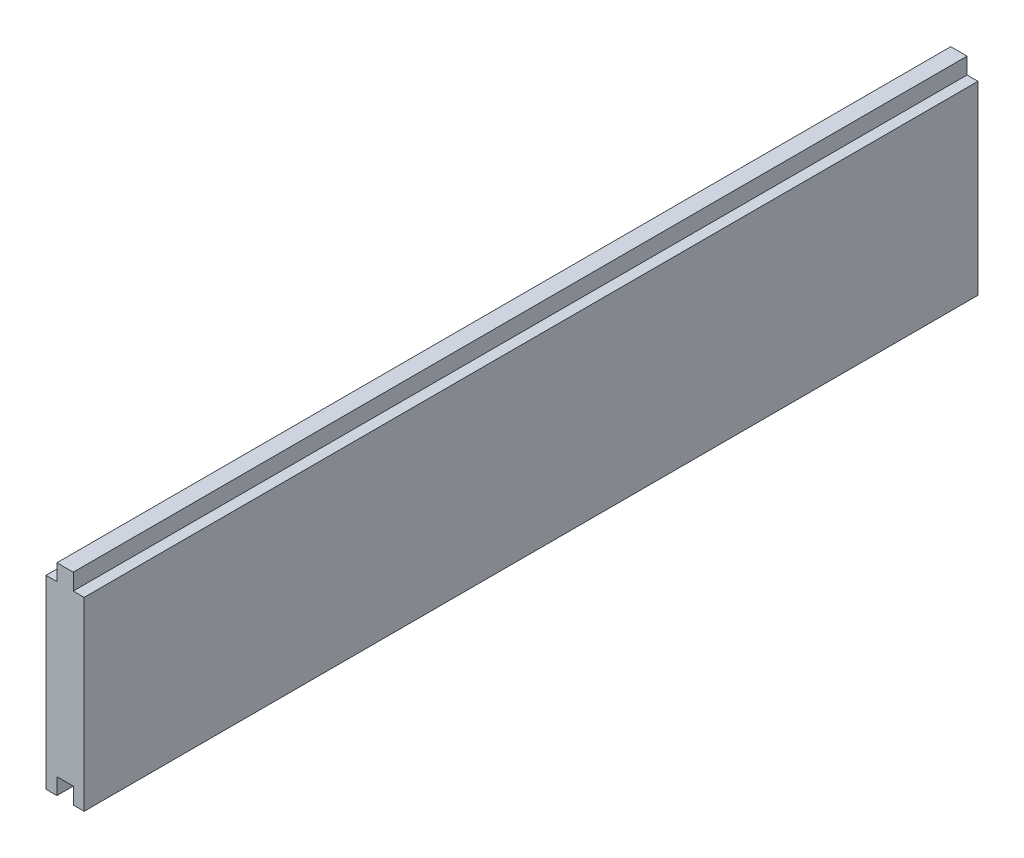
ISO-10303-21;
HEADER;
FILE_DESCRIPTION(('STEP AP214'),'2;1');
FILE_NAME('part.step','',(''),(''),'','','');
FILE_SCHEMA(('AUTOMOTIVE_DESIGN { 1 0 10303 214 1 1 1 1 }'));
ENDSEC;
DATA;
#1=APPLICATION_CONTEXT('core data for automotive mechanical design processes');
#2=APPLICATION_PROTOCOL_DEFINITION('international standard','automotive_design',2000,#1);
#3=PRODUCT_CONTEXT('',#1,'mechanical');
#4=PRODUCT('Part','Part','',(#3));
#5=PRODUCT_RELATED_PRODUCT_CATEGORY('part','',(#4));
#6=PRODUCT_DEFINITION_FORMATION('','',#4);
#7=PRODUCT_DEFINITION_CONTEXT('part definition',#1,'design');
#8=PRODUCT_DEFINITION('design','',#6,#7);
#9=PRODUCT_DEFINITION_SHAPE('','',#8);
#10=(LENGTH_UNIT() NAMED_UNIT(*) SI_UNIT(.MILLI.,.METRE.));
#11=(NAMED_UNIT(*) PLANE_ANGLE_UNIT() SI_UNIT($,.RADIAN.));
#12=(NAMED_UNIT(*) SI_UNIT($,.STERADIAN.) SOLID_ANGLE_UNIT());
#13=UNCERTAINTY_MEASURE_WITH_UNIT(LENGTH_MEASURE(1.E-05),#10,'distance_accuracy_value','');
#14=(GEOMETRIC_REPRESENTATION_CONTEXT(3) GLOBAL_UNCERTAINTY_ASSIGNED_CONTEXT((#13)) GLOBAL_UNIT_ASSIGNED_CONTEXT((#10,
#11,#12)) REPRESENTATION_CONTEXT('',''));
#15=CARTESIAN_POINT('',(0.,0.,0.));
#16=DIRECTION('',(0.,0.,1.));
#17=DIRECTION('',(1.,0.,0.));
#18=AXIS2_PLACEMENT_3D('',#15,#16,#17);
#19=CARTESIAN_POINT('',(10.,0.,-820.));
#20=DIRECTION('',(0.,-1.,0.));
#21=DIRECTION('',(1.,0.,0.));
#22=AXIS2_PLACEMENT_3D('',#19,#20,#21);
#23=PLANE('',#22);
#24=DIRECTION('',(1.,0.,0.));
#25=VECTOR('',#24,1.);
#26=CARTESIAN_POINT('',(10.,0.,0.));
#27=LINE('',#26,#25);
#28=CARTESIAN_POINT('',(0.,0.,0.));
#29=VERTEX_POINT('',#28);
#30=CARTESIAN_POINT('',(10.,0.,0.));
#31=VERTEX_POINT('',#30);
#32=EDGE_CURVE('E157',#29,#31,#27,.T.);
#33=ORIENTED_EDGE('',*,*,#32,.F.);
#34=DIRECTION('',(0.,0.,1.));
#35=VECTOR('',#34,1.);
#36=CARTESIAN_POINT('',(0.,0.,-820.));
#37=LINE('',#36,#35);
#38=CARTESIAN_POINT('',(0.,0.,-820.));
#39=VERTEX_POINT('',#38);
#40=EDGE_CURVE('E11',#39,#29,#37,.T.);
#41=ORIENTED_EDGE('',*,*,#40,.F.);
#42=DIRECTION('',(1.,0.,0.));
#43=VECTOR('',#42,1.);
#44=CARTESIAN_POINT('',(10.,0.,-820.));
#45=LINE('',#44,#43);
#46=CARTESIAN_POINT('',(10.,0.,-820.));
#47=VERTEX_POINT('',#46);
#48=EDGE_CURVE('E189',#39,#47,#45,.T.);
#49=ORIENTED_EDGE('',*,*,#48,.T.);
#50=DIRECTION('',(0.,0.,1.));
#51=VECTOR('',#50,1.);
#52=CARTESIAN_POINT('',(10.,0.,-820.));
#53=LINE('',#52,#51);
#54=EDGE_CURVE('E39',#47,#31,#53,.T.);
#55=ORIENTED_EDGE('',*,*,#54,.T.);
#56=EDGE_LOOP('',(#33,#41,#49,#55));
#57=FACE_BOUND('',#56,.T.);
#58=ADVANCED_FACE('F36',(#57),#23,.T.);
#59=CARTESIAN_POINT('',(0.,0.,-820.));
#60=DIRECTION('',(-1.,0.,0.));
#61=DIRECTION('',(0.,0.,1.));
#62=AXIS2_PLACEMENT_3D('',#59,#60,#61);
#63=PLANE('',#62);
#64=DIRECTION('',(0.,-1.,0.));
#65=VECTOR('',#64,1.);
#66=CARTESIAN_POINT('',(0.,0.,0.));
#67=LINE('',#66,#65);
#68=CARTESIAN_POINT('',(0.,170.,0.));
#69=VERTEX_POINT('',#68);
#70=EDGE_CURVE('E187',#69,#29,#67,.T.);
#71=ORIENTED_EDGE('',*,*,#70,.F.);
#72=DIRECTION('',(0.,0.,1.));
#73=VECTOR('',#72,1.);
#74=CARTESIAN_POINT('',(0.,170.,-820.));
#75=LINE('',#74,#73);
#76=CARTESIAN_POINT('',(0.,170.,-820.));
#77=VERTEX_POINT('',#76);
#78=EDGE_CURVE('E45',#77,#69,#75,.T.);
#79=ORIENTED_EDGE('',*,*,#78,.F.);
#80=DIRECTION('',(0.,-1.,0.));
#81=VECTOR('',#80,1.);
#82=CARTESIAN_POINT('',(0.,0.,-820.));
#83=LINE('',#82,#81);
#84=EDGE_CURVE('E147',#77,#39,#83,.T.);
#85=ORIENTED_EDGE('',*,*,#84,.T.);
#86=ORIENTED_EDGE('',*,*,#40,.T.);
#87=EDGE_LOOP('',(#71,#79,#85,#86));
#88=FACE_BOUND('',#87,.T.);
#89=ADVANCED_FACE('F209',(#88),#63,.T.);
#90=CARTESIAN_POINT('',(9.99999999999998,170.,-820.));
#91=DIRECTION('',(0.,1.,0.));
#92=DIRECTION('',(0.,0.,1.));
#93=AXIS2_PLACEMENT_3D('',#90,#91,#92);
#94=PLANE('',#93);
#95=DIRECTION('',(-1.,0.,0.));
#96=VECTOR('',#95,1.);
#97=CARTESIAN_POINT('',(9.99999999999998,170.,0.));
#98=LINE('',#97,#96);
#99=CARTESIAN_POINT('',(9.99999999999998,170.,0.));
#100=VERTEX_POINT('',#99);
#101=EDGE_CURVE('E134',#100,#69,#98,.T.);
#102=ORIENTED_EDGE('',*,*,#101,.F.);
#103=DIRECTION('',(0.,0.,1.));
#104=VECTOR('',#103,1.);
#105=CARTESIAN_POINT('',(9.99999999999998,170.,-820.));
#106=LINE('',#105,#104);
#107=CARTESIAN_POINT('',(9.99999999999998,170.,-820.));
#108=VERTEX_POINT('',#107);
#109=EDGE_CURVE('E129',#108,#100,#106,.T.);
#110=ORIENTED_EDGE('',*,*,#109,.F.);
#111=DIRECTION('',(-1.,0.,0.));
#112=VECTOR('',#111,1.);
#113=CARTESIAN_POINT('',(9.99999999999998,170.,-820.));
#114=LINE('',#113,#112);
#115=EDGE_CURVE('E132',#108,#77,#114,.T.);
#116=ORIENTED_EDGE('',*,*,#115,.T.);
#117=ORIENTED_EDGE('',*,*,#78,.T.);
#118=EDGE_LOOP('',(#102,#110,#116,#117));
#119=FACE_BOUND('',#118,.T.);
#120=ADVANCED_FACE('F131',(#119),#94,.T.);
#121=CARTESIAN_POINT('',(9.99999999999998,185.,-820.));
#122=DIRECTION('',(-1.,0.,0.));
#123=DIRECTION('',(0.,-1.,0.));
#124=AXIS2_PLACEMENT_3D('',#121,#122,#123);
#125=PLANE('',#124);
#126=DIRECTION('',(0.,-1.,0.));
#127=VECTOR('',#126,1.);
#128=CARTESIAN_POINT('',(9.99999999999998,185.,0.));
#129=LINE('',#128,#127);
#130=CARTESIAN_POINT('',(9.99999999999998,185.,0.));
#131=VERTEX_POINT('',#130);
#132=EDGE_CURVE('E184',#131,#100,#129,.T.);
#133=ORIENTED_EDGE('',*,*,#132,.F.);
#134=DIRECTION('',(0.,0.,1.));
#135=VECTOR('',#134,1.);
#136=CARTESIAN_POINT('',(9.99999999999998,185.,-820.));
#137=LINE('',#136,#135);
#138=CARTESIAN_POINT('',(9.99999999999998,185.,-820.));
#139=VERTEX_POINT('',#138);
#140=EDGE_CURVE('E139',#139,#131,#137,.T.);
#141=ORIENTED_EDGE('',*,*,#140,.F.);
#142=DIRECTION('',(0.,-1.,0.));
#143=VECTOR('',#142,1.);
#144=CARTESIAN_POINT('',(9.99999999999998,185.,-820.));
#145=LINE('',#144,#143);
#146=EDGE_CURVE('E145',#139,#108,#145,.T.);
#147=ORIENTED_EDGE('',*,*,#146,.T.);
#148=ORIENTED_EDGE('',*,*,#109,.T.);
#149=EDGE_LOOP('',(#133,#141,#147,#148));
#150=FACE_BOUND('',#149,.T.);
#151=ADVANCED_FACE('F149',(#150),#125,.T.);
#152=CARTESIAN_POINT('',(25.,185.,-820.));
#153=DIRECTION('',(0.,1.,0.));
#154=DIRECTION('',(0.,0.,1.));
#155=AXIS2_PLACEMENT_3D('',#152,#153,#154);
#156=PLANE('',#155);
#157=DIRECTION('',(-1.,0.,0.));
#158=VECTOR('',#157,1.);
#159=CARTESIAN_POINT('',(25.,185.,0.));
#160=LINE('',#159,#158);
#161=CARTESIAN_POINT('',(25.,185.,0.));
#162=VERTEX_POINT('',#161);
#163=EDGE_CURVE('E181',#162,#131,#160,.T.);
#164=ORIENTED_EDGE('',*,*,#163,.F.);
#165=DIRECTION('',(0.,0.,1.));
#166=VECTOR('',#165,1.);
#167=CARTESIAN_POINT('',(25.,185.,-820.));
#168=LINE('',#167,#166);
#169=CARTESIAN_POINT('',(25.,185.,-820.));
#170=VERTEX_POINT('',#169);
#171=EDGE_CURVE('E193',#170,#162,#168,.T.);
#172=ORIENTED_EDGE('',*,*,#171,.F.);
#173=DIRECTION('',(-1.,0.,0.));
#174=VECTOR('',#173,1.);
#175=CARTESIAN_POINT('',(25.,185.,-820.));
#176=LINE('',#175,#174);
#177=EDGE_CURVE('E150',#170,#139,#176,.T.);
#178=ORIENTED_EDGE('',*,*,#177,.T.);
#179=ORIENTED_EDGE('',*,*,#140,.T.);
#180=EDGE_LOOP('',(#164,#172,#178,#179));
#181=FACE_BOUND('',#180,.T.);
#182=ADVANCED_FACE('F222',(#181),#156,.T.);
#183=CARTESIAN_POINT('',(25.,170.,-820.));
#184=DIRECTION('',(1.,0.,0.));
#185=DIRECTION('',(0.,0.,-1.));
#186=AXIS2_PLACEMENT_3D('',#183,#184,#185);
#187=PLANE('',#186);
#188=DIRECTION('',(0.,1.,0.));
#189=VECTOR('',#188,1.);
#190=CARTESIAN_POINT('',(25.,170.,0.));
#191=LINE('',#190,#189);
#192=CARTESIAN_POINT('',(25.,170.,0.));
#193=VERTEX_POINT('',#192);
#194=EDGE_CURVE('E178',#193,#162,#191,.T.);
#195=ORIENTED_EDGE('',*,*,#194,.F.);
#196=DIRECTION('',(0.,0.,1.));
#197=VECTOR('',#196,1.);
#198=CARTESIAN_POINT('',(25.,170.,-820.));
#199=LINE('',#198,#197);
#200=CARTESIAN_POINT('',(25.,170.,-820.));
#201=VERTEX_POINT('',#200);
#202=EDGE_CURVE('E195',#201,#193,#199,.T.);
#203=ORIENTED_EDGE('',*,*,#202,.F.);
#204=DIRECTION('',(0.,1.,0.));
#205=VECTOR('',#204,1.);
#206=CARTESIAN_POINT('',(25.,170.,-820.));
#207=LINE('',#206,#205);
#208=EDGE_CURVE('E152',#201,#170,#207,.T.);
#209=ORIENTED_EDGE('',*,*,#208,.T.);
#210=ORIENTED_EDGE('',*,*,#171,.T.);
#211=EDGE_LOOP('',(#195,#203,#209,#210));
#212=FACE_BOUND('',#211,.T.);
#213=ADVANCED_FACE('F225',(#212),#187,.T.);
#214=CARTESIAN_POINT('',(35.,170.,-820.));
#215=DIRECTION('',(0.,1.,0.));
#216=DIRECTION('',(0.,0.,1.));
#217=AXIS2_PLACEMENT_3D('',#214,#215,#216);
#218=PLANE('',#217);
#219=DIRECTION('',(-1.,0.,0.));
#220=VECTOR('',#219,1.);
#221=CARTESIAN_POINT('',(35.,170.,0.));
#222=LINE('',#221,#220);
#223=CARTESIAN_POINT('',(35.,170.,0.));
#224=VERTEX_POINT('',#223);
#225=EDGE_CURVE('E175',#224,#193,#222,.T.);
#226=ORIENTED_EDGE('',*,*,#225,.F.);
#227=DIRECTION('',(0.,0.,1.));
#228=VECTOR('',#227,1.);
#229=CARTESIAN_POINT('',(35.,170.,-820.));
#230=LINE('',#229,#228);
#231=CARTESIAN_POINT('',(35.,170.,-820.));
#232=VERTEX_POINT('',#231);
#233=EDGE_CURVE('E197',#232,#224,#230,.T.);
#234=ORIENTED_EDGE('',*,*,#233,.F.);
#235=DIRECTION('',(-1.,0.,0.));
#236=VECTOR('',#235,1.);
#237=CARTESIAN_POINT('',(35.,170.,-820.));
#238=LINE('',#237,#236);
#239=EDGE_CURVE('E351',#232,#201,#238,.T.);
#240=ORIENTED_EDGE('',*,*,#239,.T.);
#241=ORIENTED_EDGE('',*,*,#202,.T.);
#242=EDGE_LOOP('',(#226,#234,#240,#241));
#243=FACE_BOUND('',#242,.T.);
#244=ADVANCED_FACE('F229',(#243),#218,.T.);
#245=CARTESIAN_POINT('',(35.,170.,-820.));
#246=DIRECTION('',(1.,0.,0.));
#247=DIRECTION('',(0.,1.,0.));
#248=AXIS2_PLACEMENT_3D('',#245,#246,#247);
#249=PLANE('',#248);
#250=DIRECTION('',(0.,1.,0.));
#251=VECTOR('',#250,1.);
#252=CARTESIAN_POINT('',(35.,170.,0.));
#253=LINE('',#252,#251);
#254=CARTESIAN_POINT('',(35.,0.,0.));
#255=VERTEX_POINT('',#254);
#256=EDGE_CURVE('E172',#255,#224,#253,.T.);
#257=ORIENTED_EDGE('',*,*,#256,.F.);
#258=DIRECTION('',(0.,0.,1.));
#259=VECTOR('',#258,1.);
#260=CARTESIAN_POINT('',(35.,0.,-820.));
#261=LINE('',#260,#259);
#262=CARTESIAN_POINT('',(35.,0.,-820.));
#263=VERTEX_POINT('',#262);
#264=EDGE_CURVE('E199',#263,#255,#261,.T.);
#265=ORIENTED_EDGE('',*,*,#264,.F.);
#266=DIRECTION('',(0.,1.,0.));
#267=VECTOR('',#266,1.);
#268=CARTESIAN_POINT('',(35.,170.,-820.));
#269=LINE('',#268,#267);
#270=EDGE_CURVE('E355',#263,#232,#269,.T.);
#271=ORIENTED_EDGE('',*,*,#270,.T.);
#272=ORIENTED_EDGE('',*,*,#233,.T.);
#273=EDGE_LOOP('',(#257,#265,#271,#272));
#274=FACE_BOUND('',#273,.T.);
#275=ADVANCED_FACE('F233',(#274),#249,.T.);
#276=CARTESIAN_POINT('',(35.,0.,-820.));
#277=DIRECTION('',(0.,-1.,0.));
#278=DIRECTION('',(1.,0.,0.));
#279=AXIS2_PLACEMENT_3D('',#276,#277,#278);
#280=PLANE('',#279);
#281=DIRECTION('',(1.,0.,0.));
#282=VECTOR('',#281,1.);
#283=CARTESIAN_POINT('',(35.,0.,0.));
#284=LINE('',#283,#282);
#285=CARTESIAN_POINT('',(25.,0.,0.));
#286=VERTEX_POINT('',#285);
#287=EDGE_CURVE('E169',#286,#255,#284,.T.);
#288=ORIENTED_EDGE('',*,*,#287,.F.);
#289=DIRECTION('',(0.,0.,1.));
#290=VECTOR('',#289,1.);
#291=CARTESIAN_POINT('',(25.,0.,-820.));
#292=LINE('',#291,#290);
#293=CARTESIAN_POINT('',(25.,0.,-820.));
#294=VERTEX_POINT('',#293);
#295=EDGE_CURVE('E201',#294,#286,#292,.T.);
#296=ORIENTED_EDGE('',*,*,#295,.F.);
#297=DIRECTION('',(1.,0.,0.));
#298=VECTOR('',#297,1.);
#299=CARTESIAN_POINT('',(35.,0.,-820.));
#300=LINE('',#299,#298);
#301=EDGE_CURVE('E344',#294,#263,#300,.T.);
#302=ORIENTED_EDGE('',*,*,#301,.T.);
#303=ORIENTED_EDGE('',*,*,#264,.T.);
#304=EDGE_LOOP('',(#288,#296,#302,#303));
#305=FACE_BOUND('',#304,.T.);
#306=ADVANCED_FACE('F237',(#305),#280,.T.);
#307=CARTESIAN_POINT('',(25.,0.,-820.));
#308=DIRECTION('',(-1.,0.,0.));
#309=DIRECTION('',(0.,0.,1.));
#310=AXIS2_PLACEMENT_3D('',#307,#308,#309);
#311=PLANE('',#310);
#312=DIRECTION('',(0.,-1.,0.));
#313=VECTOR('',#312,1.);
#314=CARTESIAN_POINT('',(25.,0.,0.));
#315=LINE('',#314,#313);
#316=CARTESIAN_POINT('',(25.,15.,0.));
#317=VERTEX_POINT('',#316);
#318=EDGE_CURVE('E166',#317,#286,#315,.T.);
#319=ORIENTED_EDGE('',*,*,#318,.F.);
#320=DIRECTION('',(0.,0.,1.));
#321=VECTOR('',#320,1.);
#322=CARTESIAN_POINT('',(25.,15.,-820.));
#323=LINE('',#322,#321);
#324=CARTESIAN_POINT('',(25.,15.,-820.));
#325=VERTEX_POINT('',#324);
#326=EDGE_CURVE('E203',#325,#317,#323,.T.);
#327=ORIENTED_EDGE('',*,*,#326,.F.);
#328=DIRECTION('',(0.,-1.,0.));
#329=VECTOR('',#328,1.);
#330=CARTESIAN_POINT('',(25.,0.,-820.));
#331=LINE('',#330,#329);
#332=EDGE_CURVE('E340',#325,#294,#331,.T.);
#333=ORIENTED_EDGE('',*,*,#332,.T.);
#334=ORIENTED_EDGE('',*,*,#295,.T.);
#335=EDGE_LOOP('',(#319,#327,#333,#334));
#336=FACE_BOUND('',#335,.T.);
#337=ADVANCED_FACE('F241',(#336),#311,.T.);
#338=CARTESIAN_POINT('',(25.,15.,-820.));
#339=DIRECTION('',(0.,-1.,0.));
#340=DIRECTION('',(1.,0.,0.));
#341=AXIS2_PLACEMENT_3D('',#338,#339,#340);
#342=PLANE('',#341);
#343=DIRECTION('',(1.,0.,0.));
#344=VECTOR('',#343,1.);
#345=CARTESIAN_POINT('',(25.,15.,0.));
#346=LINE('',#345,#344);
#347=CARTESIAN_POINT('',(10.,15.,0.));
#348=VERTEX_POINT('',#347);
#349=EDGE_CURVE('E163',#348,#317,#346,.T.);
#350=ORIENTED_EDGE('',*,*,#349,.F.);
#351=DIRECTION('',(0.,0.,1.));
#352=VECTOR('',#351,1.);
#353=CARTESIAN_POINT('',(10.,15.,-820.));
#354=LINE('',#353,#352);
#355=CARTESIAN_POINT('',(10.,15.,-820.));
#356=VERTEX_POINT('',#355);
#357=EDGE_CURVE('E204',#356,#348,#354,.T.);
#358=ORIENTED_EDGE('',*,*,#357,.F.);
#359=DIRECTION('',(1.,0.,0.));
#360=VECTOR('',#359,1.);
#361=CARTESIAN_POINT('',(25.,15.,-820.));
#362=LINE('',#361,#360);
#363=EDGE_CURVE('E361',#356,#325,#362,.T.);
#364=ORIENTED_EDGE('',*,*,#363,.T.);
#365=ORIENTED_EDGE('',*,*,#326,.T.);
#366=EDGE_LOOP('',(#350,#358,#364,#365));
#367=FACE_BOUND('',#366,.T.);
#368=ADVANCED_FACE('F245',(#367),#342,.T.);
#369=CARTESIAN_POINT('',(10.,15.,-820.));
#370=DIRECTION('',(1.,0.,0.));
#371=DIRECTION('',(0.,1.,0.));
#372=AXIS2_PLACEMENT_3D('',#369,#370,#371);
#373=PLANE('',#372);
#374=DIRECTION('',(0.,1.,0.));
#375=VECTOR('',#374,1.);
#376=CARTESIAN_POINT('',(10.,15.,0.));
#377=LINE('',#376,#375);
#378=EDGE_CURVE('E160',#31,#348,#377,.T.);
#379=ORIENTED_EDGE('',*,*,#378,.F.);
#380=ORIENTED_EDGE('',*,*,#54,.F.);
#381=DIRECTION('',(0.,1.,0.));
#382=VECTOR('',#381,1.);
#383=CARTESIAN_POINT('',(10.,15.,-820.));
#384=LINE('',#383,#382);
#385=EDGE_CURVE('E363',#47,#356,#384,.T.);
#386=ORIENTED_EDGE('',*,*,#385,.T.);
#387=ORIENTED_EDGE('',*,*,#357,.T.);
#388=EDGE_LOOP('',(#379,#380,#386,#387));
#389=FACE_BOUND('',#388,.T.);
#390=ADVANCED_FACE('F206',(#389),#373,.T.);
#391=CARTESIAN_POINT('',(0.,0.,-820.));
#392=DIRECTION('',(0.,0.,-1.));
#393=DIRECTION('',(-1.,0.,0.));
#394=AXIS2_PLACEMENT_3D('',#391,#392,#393);
#395=PLANE('',#394);
#396=ORIENTED_EDGE('',*,*,#48,.F.);
#397=ORIENTED_EDGE('',*,*,#84,.F.);
#398=ORIENTED_EDGE('',*,*,#115,.F.);
#399=ORIENTED_EDGE('',*,*,#146,.F.);
#400=ORIENTED_EDGE('',*,*,#177,.F.);
#401=ORIENTED_EDGE('',*,*,#208,.F.);
#402=ORIENTED_EDGE('',*,*,#239,.F.);
#403=ORIENTED_EDGE('',*,*,#270,.F.);
#404=ORIENTED_EDGE('',*,*,#301,.F.);
#405=ORIENTED_EDGE('',*,*,#332,.F.);
#406=ORIENTED_EDGE('',*,*,#363,.F.);
#407=ORIENTED_EDGE('',*,*,#385,.F.);
#408=EDGE_LOOP('',(#396,#397,#398,#399,#400,#401,#402,#403,#404,#405,#406,#407));
#409=FACE_BOUND('',#408,.T.);
#410=ADVANCED_FACE('F143',(#409),#395,.T.);
#411=CARTESIAN_POINT('',(0.,0.,0.));
#412=DIRECTION('',(0.,0.,-1.));
#413=DIRECTION('',(-1.,0.,0.));
#414=AXIS2_PLACEMENT_3D('',#411,#412,#413);
#415=PLANE('',#414);
#416=ORIENTED_EDGE('',*,*,#32,.T.);
#417=ORIENTED_EDGE('',*,*,#378,.T.);
#418=ORIENTED_EDGE('',*,*,#349,.T.);
#419=ORIENTED_EDGE('',*,*,#318,.T.);
#420=ORIENTED_EDGE('',*,*,#287,.T.);
#421=ORIENTED_EDGE('',*,*,#256,.T.);
#422=ORIENTED_EDGE('',*,*,#225,.T.);
#423=ORIENTED_EDGE('',*,*,#194,.T.);
#424=ORIENTED_EDGE('',*,*,#163,.T.);
#425=ORIENTED_EDGE('',*,*,#132,.T.);
#426=ORIENTED_EDGE('',*,*,#101,.T.);
#427=ORIENTED_EDGE('',*,*,#70,.T.);
#428=EDGE_LOOP('',(#416,#417,#418,#419,#420,#421,#422,#423,#424,#425,#426,#427));
#429=FACE_BOUND('',#428,.T.);
#430=ADVANCED_FACE('F208',(#429),#415,.F.);
#431=CLOSED_SHELL('',(#58,#89,#120,#151,#182,#213,#244,#275,#306,#337,#368,#390,#410,#430));
#432=MANIFOLD_SOLID_BREP('B2',#431);
#433=ADVANCED_BREP_SHAPE_REPRESENTATION('',(#18,#432),#14);
#434=SHAPE_DEFINITION_REPRESENTATION(#9,#433);
ENDSEC;
END-ISO-10303-21;
